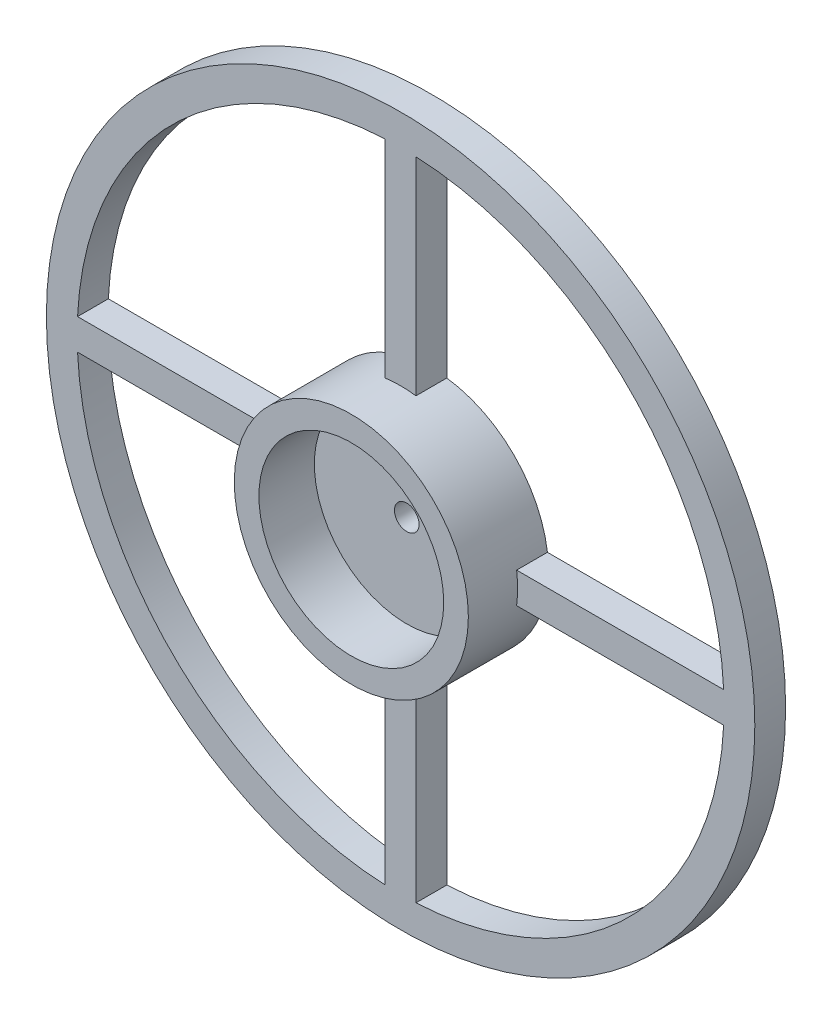
ISO-10303-21;
HEADER;
FILE_DESCRIPTION(('STEP AP214'),'2;1');
FILE_NAME('part.step','',(''),(''),'','','');
FILE_SCHEMA(('AUTOMOTIVE_DESIGN { 1 0 10303 214 1 1 1 1 }'));
ENDSEC;
DATA;
#1=APPLICATION_CONTEXT('core data for automotive mechanical design processes');
#2=APPLICATION_PROTOCOL_DEFINITION('international standard','automotive_design',2000,#1);
#3=PRODUCT_CONTEXT('',#1,'mechanical');
#4=PRODUCT('Part','Part','',(#3));
#5=PRODUCT_RELATED_PRODUCT_CATEGORY('part','',(#4));
#6=PRODUCT_DEFINITION_FORMATION('','',#4);
#7=PRODUCT_DEFINITION_CONTEXT('part definition',#1,'design');
#8=PRODUCT_DEFINITION('design','',#6,#7);
#9=PRODUCT_DEFINITION_SHAPE('','',#8);
#10=(LENGTH_UNIT() NAMED_UNIT(*) SI_UNIT(.MILLI.,.METRE.));
#11=(NAMED_UNIT(*) PLANE_ANGLE_UNIT() SI_UNIT($,.RADIAN.));
#12=(NAMED_UNIT(*) SI_UNIT($,.STERADIAN.) SOLID_ANGLE_UNIT());
#13=UNCERTAINTY_MEASURE_WITH_UNIT(LENGTH_MEASURE(1.E-05),#10,'distance_accuracy_value','');
#14=(GEOMETRIC_REPRESENTATION_CONTEXT(3) GLOBAL_UNCERTAINTY_ASSIGNED_CONTEXT((#13)) GLOBAL_UNIT_ASSIGNED_CONTEXT((#10,
#11,#12)) REPRESENTATION_CONTEXT('',''));
#15=CARTESIAN_POINT('',(0.,0.,0.));
#16=DIRECTION('',(0.,0.,1.));
#17=DIRECTION('',(1.,0.,0.));
#18=AXIS2_PLACEMENT_3D('',#15,#16,#17);
#19=CARTESIAN_POINT('',(0.,0.,5.));
#20=DIRECTION('',(0.,0.,-1.));
#21=DIRECTION('',(-1.,0.,0.));
#22=AXIS2_PLACEMENT_3D('',#19,#20,#21);
#23=CYLINDRICAL_SURFACE('',#22,2.);
#24=CARTESIAN_POINT('',(0.,0.,0.));
#25=DIRECTION('',(0.,0.,1.));
#26=DIRECTION('',(1.,0.,0.));
#27=AXIS2_PLACEMENT_3D('',#24,#25,#26);
#28=CIRCLE('',#27,2.);
#29=CARTESIAN_POINT('',(2.,0.,0.));
#30=VERTEX_POINT('',#29);
#31=EDGE_CURVE('E242',#30,#30,#28,.T.);
#32=ORIENTED_EDGE('',*,*,#31,.F.);
#33=EDGE_LOOP('',(#32));
#34=FACE_BOUND('',#33,.T.);
#35=CARTESIAN_POINT('',(0.,0.,4.));
#36=DIRECTION('',(0.,0.,1.));
#37=DIRECTION('',(1.,0.,0.));
#38=AXIS2_PLACEMENT_3D('',#35,#36,#37);
#39=CIRCLE('',#38,2.);
#40=CARTESIAN_POINT('',(2.,0.,4.));
#41=VERTEX_POINT('',#40);
#42=EDGE_CURVE('E42',#41,#41,#39,.T.);
#43=ORIENTED_EDGE('',*,*,#42,.T.);
#44=EDGE_LOOP('',(#43));
#45=FACE_BOUND('',#44,.T.);
#46=ADVANCED_FACE('F38',(#34,#45),#23,.F.);
#47=CARTESIAN_POINT('',(0.,-2.5,5.));
#48=DIRECTION('',(0.,1.,0.));
#49=DIRECTION('',(-1.,0.,0.));
#50=AXIS2_PLACEMENT_3D('',#47,#48,#49);
#51=PLANE('',#50);
#52=DIRECTION('',(1.,0.,0.));
#53=VECTOR('',#52,1.);
#54=CARTESIAN_POINT('',(0.,-2.5,0.));
#55=LINE('',#54,#53);
#56=CARTESIAN_POINT('',(-52.4404424085076,-2.50000000000001,0.));
#57=VERTEX_POINT('',#56);
#58=CARTESIAN_POINT('',(-18.8348082018374,-2.5,0.));
#59=VERTEX_POINT('',#58);
#60=EDGE_CURVE('E231',#57,#59,#55,.T.);
#61=ORIENTED_EDGE('',*,*,#60,.T.);
#62=DIRECTION('',(0.,0.,-1.));
#63=VECTOR('',#62,1.);
#64=CARTESIAN_POINT('',(-18.8348082018374,-2.5,5.));
#65=LINE('',#64,#63);
#66=CARTESIAN_POINT('',(-18.8348082018374,-2.5,5.));
#67=VERTEX_POINT('',#66);
#68=EDGE_CURVE('E180',#67,#59,#65,.T.);
#69=ORIENTED_EDGE('',*,*,#68,.F.);
#70=DIRECTION('',(1.,0.,0.));
#71=VECTOR('',#70,1.);
#72=CARTESIAN_POINT('',(0.,-2.5,5.));
#73=LINE('',#72,#71);
#74=CARTESIAN_POINT('',(-52.4404424085076,-2.50000000000001,5.));
#75=VERTEX_POINT('',#74);
#76=EDGE_CURVE('E184',#75,#67,#73,.T.);
#77=ORIENTED_EDGE('',*,*,#76,.F.);
#78=DIRECTION('',(0.,0.,-1.));
#79=VECTOR('',#78,1.);
#80=CARTESIAN_POINT('',(-52.4404424085076,-2.50000000000001,5.));
#81=LINE('',#80,#79);
#82=EDGE_CURVE('E58',#75,#57,#81,.T.);
#83=ORIENTED_EDGE('',*,*,#82,.T.);
#84=EDGE_LOOP('',(#61,#69,#77,#83));
#85=FACE_BOUND('',#84,.T.);
#86=ADVANCED_FACE('F350',(#85),#51,.F.);
#87=CARTESIAN_POINT('',(0.,0.,5.));
#88=DIRECTION('',(0.,0.,-1.));
#89=DIRECTION('',(-1.,0.,0.));
#90=AXIS2_PLACEMENT_3D('',#87,#88,#89);
#91=CYLINDRICAL_SURFACE('',#90,19.);
#92=CARTESIAN_POINT('',(0.,0.,0.));
#93=DIRECTION('',(0.,0.,1.));
#94=DIRECTION('',(1.,0.,0.));
#95=AXIS2_PLACEMENT_3D('',#92,#93,#94);
#96=CIRCLE('',#95,19.);
#97=CARTESIAN_POINT('',(-2.5,-18.8348082018374,0.));
#98=VERTEX_POINT('',#97);
#99=EDGE_CURVE('E177',#59,#98,#96,.T.);
#100=ORIENTED_EDGE('',*,*,#99,.T.);
#101=DIRECTION('',(0.,0.,-1.));
#102=VECTOR('',#101,1.);
#103=CARTESIAN_POINT('',(-2.5,-18.8348082018374,5.));
#104=LINE('',#103,#102);
#105=CARTESIAN_POINT('',(-2.5,-18.8348082018374,5.));
#106=VERTEX_POINT('',#105);
#107=EDGE_CURVE('E173',#106,#98,#104,.T.);
#108=ORIENTED_EDGE('',*,*,#107,.F.);
#109=CARTESIAN_POINT('',(0.,0.,5.));
#110=DIRECTION('',(0.,0.,1.));
#111=DIRECTION('',(1.,0.,0.));
#112=AXIS2_PLACEMENT_3D('',#109,#110,#111);
#113=CIRCLE('',#112,19.);
#114=CARTESIAN_POINT('',(2.49999999999999,-18.8348082018374,5.));
#115=VERTEX_POINT('',#114);
#116=EDGE_CURVE('E159',#106,#115,#113,.T.);
#117=ORIENTED_EDGE('',*,*,#116,.T.);
#118=DIRECTION('',(0.,0.,-1.));
#119=VECTOR('',#118,1.);
#120=CARTESIAN_POINT('',(2.49999999999999,-18.8348082018374,5.));
#121=LINE('',#120,#119);
#122=CARTESIAN_POINT('',(2.49999999999999,-18.8348082018374,0.));
#123=VERTEX_POINT('',#122);
#124=EDGE_CURVE('E246',#115,#123,#121,.T.);
#125=ORIENTED_EDGE('',*,*,#124,.T.);
#126=CARTESIAN_POINT('',(0.,0.,0.));
#127=DIRECTION('',(0.,0.,1.));
#128=DIRECTION('',(1.,0.,0.));
#129=AXIS2_PLACEMENT_3D('',#126,#127,#128);
#130=CIRCLE('',#129,19.);
#131=CARTESIAN_POINT('',(18.8348082018374,-2.5,0.));
#132=VERTEX_POINT('',#131);
#133=EDGE_CURVE('E222',#123,#132,#130,.T.);
#134=ORIENTED_EDGE('',*,*,#133,.T.);
#135=DIRECTION('',(0.,0.,-1.));
#136=VECTOR('',#135,1.);
#137=CARTESIAN_POINT('',(18.8348082018374,-2.5,5.));
#138=LINE('',#137,#136);
#139=CARTESIAN_POINT('',(18.8348082018374,-2.5,5.));
#140=VERTEX_POINT('',#139);
#141=EDGE_CURVE('E254',#140,#132,#138,.T.);
#142=ORIENTED_EDGE('',*,*,#141,.F.);
#143=CARTESIAN_POINT('',(18.8348082018374,2.5,5.));
#144=VERTEX_POINT('',#143);
#145=EDGE_CURVE('E50',#140,#144,#113,.T.);
#146=ORIENTED_EDGE('',*,*,#145,.T.);
#147=DIRECTION('',(0.,0.,-1.));
#148=VECTOR('',#147,1.);
#149=CARTESIAN_POINT('',(18.8348082018374,2.5,5.));
#150=LINE('',#149,#148);
#151=CARTESIAN_POINT('',(18.8348082018374,2.5,0.));
#152=VERTEX_POINT('',#151);
#153=EDGE_CURVE('E252',#144,#152,#150,.T.);
#154=ORIENTED_EDGE('',*,*,#153,.T.);
#155=CARTESIAN_POINT('',(0.,0.,0.));
#156=DIRECTION('',(0.,0.,1.));
#157=DIRECTION('',(1.,0.,0.));
#158=AXIS2_PLACEMENT_3D('',#155,#156,#157);
#159=CIRCLE('',#158,19.);
#160=CARTESIAN_POINT('',(2.5,18.8348082018374,0.));
#161=VERTEX_POINT('',#160);
#162=EDGE_CURVE('E210',#152,#161,#159,.T.);
#163=ORIENTED_EDGE('',*,*,#162,.T.);
#164=DIRECTION('',(0.,0.,-1.));
#165=VECTOR('',#164,1.);
#166=CARTESIAN_POINT('',(2.5,18.8348082018374,5.));
#167=LINE('',#166,#165);
#168=CARTESIAN_POINT('',(2.5,18.8348082018374,5.));
#169=VERTEX_POINT('',#168);
#170=EDGE_CURVE('E262',#169,#161,#167,.T.);
#171=ORIENTED_EDGE('',*,*,#170,.F.);
#172=CARTESIAN_POINT('',(-2.5,18.8348082018374,5.));
#173=VERTEX_POINT('',#172);
#174=EDGE_CURVE('E11',#169,#173,#113,.T.);
#175=ORIENTED_EDGE('',*,*,#174,.T.);
#176=DIRECTION('',(0.,0.,-1.));
#177=VECTOR('',#176,1.);
#178=CARTESIAN_POINT('',(-2.5,18.8348082018374,5.));
#179=LINE('',#178,#177);
#180=CARTESIAN_POINT('',(-2.5,18.8348082018374,0.));
#181=VERTEX_POINT('',#180);
#182=EDGE_CURVE('E260',#173,#181,#179,.T.);
#183=ORIENTED_EDGE('',*,*,#182,.T.);
#184=CARTESIAN_POINT('',(0.,0.,0.));
#185=DIRECTION('',(0.,0.,1.));
#186=DIRECTION('',(1.,0.,0.));
#187=AXIS2_PLACEMENT_3D('',#184,#185,#186);
#188=CIRCLE('',#187,19.);
#189=CARTESIAN_POINT('',(-18.8348082018374,2.5,0.));
#190=VERTEX_POINT('',#189);
#191=EDGE_CURVE('E198',#181,#190,#188,.T.);
#192=ORIENTED_EDGE('',*,*,#191,.T.);
#193=DIRECTION('',(0.,0.,-1.));
#194=VECTOR('',#193,1.);
#195=CARTESIAN_POINT('',(-18.8348082018374,2.5,5.));
#196=LINE('',#195,#194);
#197=CARTESIAN_POINT('',(-18.8348082018374,2.5,5.));
#198=VERTEX_POINT('',#197);
#199=EDGE_CURVE('E269',#198,#190,#196,.T.);
#200=ORIENTED_EDGE('',*,*,#199,.F.);
#201=EDGE_CURVE('E48',#198,#67,#113,.T.);
#202=ORIENTED_EDGE('',*,*,#201,.T.);
#203=ORIENTED_EDGE('',*,*,#68,.T.);
#204=EDGE_LOOP('',(#100,#108,#117,#125,#134,#142,#146,#154,#163,#171,#175,#183,#192,#200,#202,#203));
#205=FACE_BOUND('',#204,.T.);
#206=CARTESIAN_POINT('',(0.,0.,13.));
#207=DIRECTION('',(0.,0.,1.));
#208=DIRECTION('',(1.,0.,0.));
#209=AXIS2_PLACEMENT_3D('',#206,#207,#208);
#210=CIRCLE('',#209,19.);
#211=CARTESIAN_POINT('',(19.,0.,13.));
#212=VERTEX_POINT('',#211);
#213=EDGE_CURVE('E293',#212,#212,#210,.T.);
#214=ORIENTED_EDGE('',*,*,#213,.F.);
#215=EDGE_LOOP('',(#214));
#216=FACE_BOUND('',#215,.T.);
#217=ADVANCED_FACE('F174',(#205,#216),#91,.T.);
#218=CARTESIAN_POINT('',(-2.50000000000001,0.,5.));
#219=DIRECTION('',(-1.,0.,0.));
#220=DIRECTION('',(0.,-1.,0.));
#221=AXIS2_PLACEMENT_3D('',#218,#219,#220);
#222=PLANE('',#221);
#223=DIRECTION('',(0.,1.,0.));
#224=VECTOR('',#223,1.);
#225=CARTESIAN_POINT('',(-2.50000000000001,0.,0.));
#226=LINE('',#225,#224);
#227=CARTESIAN_POINT('',(-2.5,-52.4404424085076,0.));
#228=VERTEX_POINT('',#227);
#229=EDGE_CURVE('E234',#228,#98,#226,.T.);
#230=ORIENTED_EDGE('',*,*,#229,.F.);
#231=DIRECTION('',(0.,0.,-1.));
#232=VECTOR('',#231,1.);
#233=CARTESIAN_POINT('',(-2.5,-52.4404424085076,5.));
#234=LINE('',#233,#232);
#235=CARTESIAN_POINT('',(-2.5,-52.4404424085076,5.));
#236=VERTEX_POINT('',#235);
#237=EDGE_CURVE('E109',#236,#228,#234,.T.);
#238=ORIENTED_EDGE('',*,*,#237,.F.);
#239=DIRECTION('',(0.,1.,0.));
#240=VECTOR('',#239,1.);
#241=CARTESIAN_POINT('',(-2.50000000000001,0.,5.));
#242=LINE('',#241,#240);
#243=EDGE_CURVE('E165',#236,#106,#242,.T.);
#244=ORIENTED_EDGE('',*,*,#243,.T.);
#245=ORIENTED_EDGE('',*,*,#107,.T.);
#246=EDGE_LOOP('',(#230,#238,#244,#245));
#247=FACE_BOUND('',#246,.T.);
#248=ADVANCED_FACE('F182',(#247),#222,.T.);
#249=CARTESIAN_POINT('',(2.5,0.,5.));
#250=DIRECTION('',(-1.,0.,0.));
#251=DIRECTION('',(0.,-1.,0.));
#252=AXIS2_PLACEMENT_3D('',#249,#250,#251);
#253=PLANE('',#252);
#254=DIRECTION('',(0.,1.,0.));
#255=VECTOR('',#254,1.);
#256=CARTESIAN_POINT('',(2.5,0.,0.));
#257=LINE('',#256,#255);
#258=CARTESIAN_POINT('',(2.49999999999999,-52.4404424085076,0.));
#259=VERTEX_POINT('',#258);
#260=EDGE_CURVE('E219',#259,#123,#257,.T.);
#261=ORIENTED_EDGE('',*,*,#260,.T.);
#262=ORIENTED_EDGE('',*,*,#124,.F.);
#263=DIRECTION('',(0.,1.,0.));
#264=VECTOR('',#263,1.);
#265=CARTESIAN_POINT('',(2.5,0.,5.));
#266=LINE('',#265,#264);
#267=CARTESIAN_POINT('',(2.49999999999999,-52.4404424085076,5.));
#268=VERTEX_POINT('',#267);
#269=EDGE_CURVE('E168',#268,#115,#266,.T.);
#270=ORIENTED_EDGE('',*,*,#269,.F.);
#271=DIRECTION('',(0.,0.,-1.));
#272=VECTOR('',#271,1.);
#273=CARTESIAN_POINT('',(2.49999999999999,-52.4404424085076,5.));
#274=LINE('',#273,#272);
#275=EDGE_CURVE('E249',#268,#259,#274,.T.);
#276=ORIENTED_EDGE('',*,*,#275,.T.);
#277=EDGE_LOOP('',(#261,#262,#270,#276));
#278=FACE_BOUND('',#277,.T.);
#279=ADVANCED_FACE('F327',(#278),#253,.F.);
#280=CARTESIAN_POINT('',(0.,-2.50000000000002,5.));
#281=DIRECTION('',(0.,-1.,0.));
#282=DIRECTION('',(1.,0.,0.));
#283=AXIS2_PLACEMENT_3D('',#280,#281,#282);
#284=PLANE('',#283);
#285=DIRECTION('',(-1.,0.,0.));
#286=VECTOR('',#285,1.);
#287=CARTESIAN_POINT('',(0.,-2.50000000000002,0.));
#288=LINE('',#287,#286);
#289=CARTESIAN_POINT('',(52.4404424085076,-2.49999999999997,0.));
#290=VERTEX_POINT('',#289);
#291=EDGE_CURVE('E225',#290,#132,#288,.T.);
#292=ORIENTED_EDGE('',*,*,#291,.F.);
#293=DIRECTION('',(0.,0.,-1.));
#294=VECTOR('',#293,1.);
#295=CARTESIAN_POINT('',(52.4404424085076,-2.49999999999997,5.));
#296=LINE('',#295,#294);
#297=CARTESIAN_POINT('',(52.4404424085076,-2.49999999999997,5.));
#298=VERTEX_POINT('',#297);
#299=EDGE_CURVE('E251',#298,#290,#296,.T.);
#300=ORIENTED_EDGE('',*,*,#299,.F.);
#301=DIRECTION('',(-1.,0.,0.));
#302=VECTOR('',#301,1.);
#303=CARTESIAN_POINT('',(0.,-2.50000000000002,5.));
#304=LINE('',#303,#302);
#305=EDGE_CURVE('E311',#298,#140,#304,.T.);
#306=ORIENTED_EDGE('',*,*,#305,.T.);
#307=ORIENTED_EDGE('',*,*,#141,.T.);
#308=EDGE_LOOP('',(#292,#300,#306,#307));
#309=FACE_BOUND('',#308,.T.);
#310=ADVANCED_FACE('F322',(#309),#284,.T.);
#311=CARTESIAN_POINT('',(0.,2.50000000000001,5.));
#312=DIRECTION('',(0.,-1.,0.));
#313=DIRECTION('',(1.,0.,0.));
#314=AXIS2_PLACEMENT_3D('',#311,#312,#313);
#315=PLANE('',#314);
#316=DIRECTION('',(-1.,0.,0.));
#317=VECTOR('',#316,1.);
#318=CARTESIAN_POINT('',(0.,2.50000000000001,0.));
#319=LINE('',#318,#317);
#320=CARTESIAN_POINT('',(52.4404424085076,2.5,0.));
#321=VERTEX_POINT('',#320);
#322=EDGE_CURVE('E207',#321,#152,#319,.T.);
#323=ORIENTED_EDGE('',*,*,#322,.T.);
#324=ORIENTED_EDGE('',*,*,#153,.F.);
#325=DIRECTION('',(-1.,0.,0.));
#326=VECTOR('',#325,1.);
#327=CARTESIAN_POINT('',(0.,2.50000000000001,5.));
#328=LINE('',#327,#326);
#329=CARTESIAN_POINT('',(52.4404424085076,2.5,5.));
#330=VERTEX_POINT('',#329);
#331=EDGE_CURVE('E301',#330,#144,#328,.T.);
#332=ORIENTED_EDGE('',*,*,#331,.F.);
#333=DIRECTION('',(0.,0.,-1.));
#334=VECTOR('',#333,1.);
#335=CARTESIAN_POINT('',(52.4404424085076,2.5,5.));
#336=LINE('',#335,#334);
#337=EDGE_CURVE('E257',#330,#321,#336,.T.);
#338=ORIENTED_EDGE('',*,*,#337,.T.);
#339=EDGE_LOOP('',(#323,#324,#332,#338));
#340=FACE_BOUND('',#339,.T.);
#341=ADVANCED_FACE('F331',(#340),#315,.F.);
#342=CARTESIAN_POINT('',(2.49999999999999,0.,5.));
#343=DIRECTION('',(1.,0.,0.));
#344=DIRECTION('',(0.,1.,0.));
#345=AXIS2_PLACEMENT_3D('',#342,#343,#344);
#346=PLANE('',#345);
#347=DIRECTION('',(0.,-1.,0.));
#348=VECTOR('',#347,1.);
#349=CARTESIAN_POINT('',(2.49999999999999,0.,0.));
#350=LINE('',#349,#348);
#351=CARTESIAN_POINT('',(2.5,52.4404424085076,0.));
#352=VERTEX_POINT('',#351);
#353=EDGE_CURVE('E213',#352,#161,#350,.T.);
#354=ORIENTED_EDGE('',*,*,#353,.F.);
#355=DIRECTION('',(0.,0.,-1.));
#356=VECTOR('',#355,1.);
#357=CARTESIAN_POINT('',(2.5,52.4404424085076,5.));
#358=LINE('',#357,#356);
#359=CARTESIAN_POINT('',(2.5,52.4404424085076,5.));
#360=VERTEX_POINT('',#359);
#361=EDGE_CURVE('E259',#360,#352,#358,.T.);
#362=ORIENTED_EDGE('',*,*,#361,.F.);
#363=DIRECTION('',(0.,-1.,0.));
#364=VECTOR('',#363,1.);
#365=CARTESIAN_POINT('',(2.49999999999999,0.,5.));
#366=LINE('',#365,#364);
#367=EDGE_CURVE('E304',#360,#169,#366,.T.);
#368=ORIENTED_EDGE('',*,*,#367,.T.);
#369=ORIENTED_EDGE('',*,*,#170,.T.);
#370=EDGE_LOOP('',(#354,#362,#368,#369));
#371=FACE_BOUND('',#370,.T.);
#372=ADVANCED_FACE('F340',(#371),#346,.T.);
#373=CARTESIAN_POINT('',(-2.50000000000001,0.,5.));
#374=DIRECTION('',(1.,0.,0.));
#375=DIRECTION('',(0.,1.,0.));
#376=AXIS2_PLACEMENT_3D('',#373,#374,#375);
#377=PLANE('',#376);
#378=DIRECTION('',(0.,-1.,0.));
#379=VECTOR('',#378,1.);
#380=CARTESIAN_POINT('',(-2.50000000000001,0.,0.));
#381=LINE('',#380,#379);
#382=CARTESIAN_POINT('',(-2.5,52.4404424085076,0.));
#383=VERTEX_POINT('',#382);
#384=EDGE_CURVE('E195',#383,#181,#381,.T.);
#385=ORIENTED_EDGE('',*,*,#384,.T.);
#386=ORIENTED_EDGE('',*,*,#182,.F.);
#387=DIRECTION('',(0.,-1.,0.));
#388=VECTOR('',#387,1.);
#389=CARTESIAN_POINT('',(-2.50000000000001,0.,5.));
#390=LINE('',#389,#388);
#391=CARTESIAN_POINT('',(-2.5,52.4404424085076,5.));
#392=VERTEX_POINT('',#391);
#393=EDGE_CURVE('E122',#392,#173,#390,.T.);
#394=ORIENTED_EDGE('',*,*,#393,.F.);
#395=DIRECTION('',(0.,0.,-1.));
#396=VECTOR('',#395,1.);
#397=CARTESIAN_POINT('',(-2.5,52.4404424085076,5.));
#398=LINE('',#397,#396);
#399=EDGE_CURVE('E194',#392,#383,#398,.T.);
#400=ORIENTED_EDGE('',*,*,#399,.T.);
#401=EDGE_LOOP('',(#385,#386,#394,#400));
#402=FACE_BOUND('',#401,.T.);
#403=ADVANCED_FACE('F40',(#402),#377,.F.);
#404=CARTESIAN_POINT('',(0.,2.50000000000001,5.));
#405=DIRECTION('',(0.,1.,0.));
#406=DIRECTION('',(-1.,0.,0.));
#407=AXIS2_PLACEMENT_3D('',#404,#405,#406);
#408=PLANE('',#407);
#409=DIRECTION('',(1.,0.,0.));
#410=VECTOR('',#409,1.);
#411=CARTESIAN_POINT('',(0.,2.50000000000001,0.));
#412=LINE('',#411,#410);
#413=CARTESIAN_POINT('',(-52.4404424085076,2.5,0.));
#414=VERTEX_POINT('',#413);
#415=EDGE_CURVE('E201',#414,#190,#412,.T.);
#416=ORIENTED_EDGE('',*,*,#415,.F.);
#417=DIRECTION('',(0.,0.,-1.));
#418=VECTOR('',#417,1.);
#419=CARTESIAN_POINT('',(-52.4404424085076,2.5,5.));
#420=LINE('',#419,#418);
#421=CARTESIAN_POINT('',(-52.4404424085076,2.5,5.));
#422=VERTEX_POINT('',#421);
#423=EDGE_CURVE('E267',#422,#414,#420,.T.);
#424=ORIENTED_EDGE('',*,*,#423,.F.);
#425=DIRECTION('',(1.,0.,0.));
#426=VECTOR('',#425,1.);
#427=CARTESIAN_POINT('',(0.,2.50000000000001,5.));
#428=LINE('',#427,#426);
#429=EDGE_CURVE('E288',#422,#198,#428,.T.);
#430=ORIENTED_EDGE('',*,*,#429,.T.);
#431=ORIENTED_EDGE('',*,*,#199,.T.);
#432=EDGE_LOOP('',(#416,#424,#430,#431));
#433=FACE_BOUND('',#432,.T.);
#434=ADVANCED_FACE('F287',(#433),#408,.T.);
#435=CARTESIAN_POINT('',(0.,0.,5.));
#436=DIRECTION('',(0.,0.,-1.));
#437=DIRECTION('',(-1.,0.,0.));
#438=AXIS2_PLACEMENT_3D('',#435,#436,#437);
#439=CYLINDRICAL_SURFACE('',#438,57.5);
#440=CARTESIAN_POINT('',(0.,0.,5.));
#441=DIRECTION('',(0.,0.,1.));
#442=DIRECTION('',(1.,0.,0.));
#443=AXIS2_PLACEMENT_3D('',#440,#441,#442);
#444=CIRCLE('',#443,57.5);
#445=CARTESIAN_POINT('',(57.5,0.,5.));
#446=VERTEX_POINT('',#445);
#447=EDGE_CURVE('E186',#446,#446,#444,.T.);
#448=ORIENTED_EDGE('',*,*,#447,.F.);
#449=EDGE_LOOP('',(#448));
#450=FACE_BOUND('',#449,.T.);
#451=CARTESIAN_POINT('',(0.,0.,0.));
#452=DIRECTION('',(0.,0.,1.));
#453=DIRECTION('',(1.,0.,0.));
#454=AXIS2_PLACEMENT_3D('',#451,#452,#453);
#455=CIRCLE('',#454,57.5);
#456=CARTESIAN_POINT('',(57.5,0.,0.));
#457=VERTEX_POINT('',#456);
#458=EDGE_CURVE('E239',#457,#457,#455,.T.);
#459=ORIENTED_EDGE('',*,*,#458,.T.);
#460=EDGE_LOOP('',(#459));
#461=FACE_BOUND('',#460,.T.);
#462=ADVANCED_FACE('F362',(#450,#461),#439,.T.);
#463=CARTESIAN_POINT('',(0.,0.,5.));
#464=DIRECTION('',(0.,0.,-1.));
#465=DIRECTION('',(-1.,0.,0.));
#466=AXIS2_PLACEMENT_3D('',#463,#464,#465);
#467=CYLINDRICAL_SURFACE('',#466,52.5);
#468=CARTESIAN_POINT('',(0.,0.,0.));
#469=DIRECTION('',(0.,0.,1.));
#470=DIRECTION('',(1.,0.,0.));
#471=AXIS2_PLACEMENT_3D('',#468,#469,#470);
#472=CIRCLE('',#471,52.5);
#473=EDGE_CURVE('E236',#57,#228,#472,.T.);
#474=ORIENTED_EDGE('',*,*,#473,.F.);
#475=ORIENTED_EDGE('',*,*,#82,.F.);
#476=CARTESIAN_POINT('',(0.,0.,5.));
#477=DIRECTION('',(0.,0.,1.));
#478=DIRECTION('',(1.,0.,0.));
#479=AXIS2_PLACEMENT_3D('',#476,#477,#478);
#480=CIRCLE('',#479,52.5);
#481=EDGE_CURVE('E183',#75,#236,#480,.T.);
#482=ORIENTED_EDGE('',*,*,#481,.T.);
#483=ORIENTED_EDGE('',*,*,#237,.T.);
#484=EDGE_LOOP('',(#474,#475,#482,#483));
#485=FACE_BOUND('',#484,.T.);
#486=ADVANCED_FACE('F365',(#485),#467,.F.);
#487=CARTESIAN_POINT('',(0.,0.,5.));
#488=DIRECTION('',(0.,0.,-1.));
#489=DIRECTION('',(-1.,0.,0.));
#490=AXIS2_PLACEMENT_3D('',#487,#488,#489);
#491=CYLINDRICAL_SURFACE('',#490,52.5);
#492=CARTESIAN_POINT('',(0.,0.,0.));
#493=DIRECTION('',(0.,0.,1.));
#494=DIRECTION('',(1.,0.,0.));
#495=AXIS2_PLACEMENT_3D('',#492,#493,#494);
#496=CIRCLE('',#495,52.5);
#497=EDGE_CURVE('E228',#259,#290,#496,.T.);
#498=ORIENTED_EDGE('',*,*,#497,.F.);
#499=ORIENTED_EDGE('',*,*,#275,.F.);
#500=CARTESIAN_POINT('',(0.,0.,5.));
#501=DIRECTION('',(0.,0.,1.));
#502=DIRECTION('',(1.,0.,0.));
#503=AXIS2_PLACEMENT_3D('',#500,#501,#502);
#504=CIRCLE('',#503,52.5);
#505=EDGE_CURVE('E188',#268,#298,#504,.T.);
#506=ORIENTED_EDGE('',*,*,#505,.T.);
#507=ORIENTED_EDGE('',*,*,#299,.T.);
#508=EDGE_LOOP('',(#498,#499,#506,#507));
#509=FACE_BOUND('',#508,.T.);
#510=ADVANCED_FACE('F316',(#509),#491,.F.);
#511=CARTESIAN_POINT('',(0.,0.,5.));
#512=DIRECTION('',(0.,0.,-1.));
#513=DIRECTION('',(-1.,0.,0.));
#514=AXIS2_PLACEMENT_3D('',#511,#512,#513);
#515=CYLINDRICAL_SURFACE('',#514,52.5);
#516=CARTESIAN_POINT('',(0.,0.,0.));
#517=DIRECTION('',(0.,0.,1.));
#518=DIRECTION('',(1.,0.,0.));
#519=AXIS2_PLACEMENT_3D('',#516,#517,#518);
#520=CIRCLE('',#519,52.5);
#521=EDGE_CURVE('E216',#321,#352,#520,.T.);
#522=ORIENTED_EDGE('',*,*,#521,.F.);
#523=ORIENTED_EDGE('',*,*,#337,.F.);
#524=CARTESIAN_POINT('',(0.,0.,5.));
#525=DIRECTION('',(0.,0.,1.));
#526=DIRECTION('',(1.,0.,0.));
#527=AXIS2_PLACEMENT_3D('',#524,#525,#526);
#528=CIRCLE('',#527,52.5);
#529=EDGE_CURVE('E307',#330,#360,#528,.T.);
#530=ORIENTED_EDGE('',*,*,#529,.T.);
#531=ORIENTED_EDGE('',*,*,#361,.T.);
#532=EDGE_LOOP('',(#522,#523,#530,#531));
#533=FACE_BOUND('',#532,.T.);
#534=ADVANCED_FACE('F337',(#533),#515,.F.);
#535=CARTESIAN_POINT('',(0.,0.,5.));
#536=DIRECTION('',(0.,0.,-1.));
#537=DIRECTION('',(-1.,0.,0.));
#538=AXIS2_PLACEMENT_3D('',#535,#536,#537);
#539=CYLINDRICAL_SURFACE('',#538,52.5);
#540=CARTESIAN_POINT('',(0.,0.,0.));
#541=DIRECTION('',(0.,0.,1.));
#542=DIRECTION('',(1.,0.,0.));
#543=AXIS2_PLACEMENT_3D('',#540,#541,#542);
#544=CIRCLE('',#543,52.5);
#545=EDGE_CURVE('E204',#383,#414,#544,.T.);
#546=ORIENTED_EDGE('',*,*,#545,.F.);
#547=ORIENTED_EDGE('',*,*,#399,.F.);
#548=CARTESIAN_POINT('',(0.,0.,5.));
#549=DIRECTION('',(0.,0.,1.));
#550=DIRECTION('',(1.,0.,0.));
#551=AXIS2_PLACEMENT_3D('',#548,#549,#550);
#552=CIRCLE('',#551,52.5);
#553=EDGE_CURVE('E283',#392,#422,#552,.T.);
#554=ORIENTED_EDGE('',*,*,#553,.T.);
#555=ORIENTED_EDGE('',*,*,#423,.T.);
#556=EDGE_LOOP('',(#546,#547,#554,#555));
#557=FACE_BOUND('',#556,.T.);
#558=ADVANCED_FACE('F280',(#557),#539,.F.);
#559=CARTESIAN_POINT('',(0.,0.,5.));
#560=DIRECTION('',(0.,0.,1.));
#561=DIRECTION('',(1.,0.,0.));
#562=AXIS2_PLACEMENT_3D('',#559,#560,#561);
#563=PLANE('',#562);
#564=ORIENTED_EDGE('',*,*,#174,.F.);
#565=ORIENTED_EDGE('',*,*,#367,.F.);
#566=ORIENTED_EDGE('',*,*,#529,.F.);
#567=ORIENTED_EDGE('',*,*,#331,.T.);
#568=ORIENTED_EDGE('',*,*,#145,.F.);
#569=ORIENTED_EDGE('',*,*,#305,.F.);
#570=ORIENTED_EDGE('',*,*,#505,.F.);
#571=ORIENTED_EDGE('',*,*,#269,.T.);
#572=ORIENTED_EDGE('',*,*,#116,.F.);
#573=ORIENTED_EDGE('',*,*,#243,.F.);
#574=ORIENTED_EDGE('',*,*,#481,.F.);
#575=ORIENTED_EDGE('',*,*,#76,.T.);
#576=ORIENTED_EDGE('',*,*,#201,.F.);
#577=ORIENTED_EDGE('',*,*,#429,.F.);
#578=ORIENTED_EDGE('',*,*,#553,.F.);
#579=ORIENTED_EDGE('',*,*,#393,.T.);
#580=EDGE_LOOP('',(#564,#565,#566,#567,#568,#569,#570,#571,#572,#573,#574,#575,#576,#577,#578,#579));
#581=FACE_BOUND('',#580,.T.);
#582=ORIENTED_EDGE('',*,*,#447,.T.);
#583=EDGE_LOOP('',(#582));
#584=FACE_BOUND('',#583,.T.);
#585=ADVANCED_FACE('F161',(#581,#584),#563,.T.);
#586=CARTESIAN_POINT('',(0.,0.,0.));
#587=DIRECTION('',(0.,0.,1.));
#588=DIRECTION('',(1.,0.,0.));
#589=AXIS2_PLACEMENT_3D('',#586,#587,#588);
#590=PLANE('',#589);
#591=ORIENTED_EDGE('',*,*,#384,.F.);
#592=ORIENTED_EDGE('',*,*,#545,.T.);
#593=ORIENTED_EDGE('',*,*,#415,.T.);
#594=ORIENTED_EDGE('',*,*,#191,.F.);
#595=EDGE_LOOP('',(#591,#592,#593,#594));
#596=FACE_BOUND('',#595,.T.);
#597=ORIENTED_EDGE('',*,*,#322,.F.);
#598=ORIENTED_EDGE('',*,*,#521,.T.);
#599=ORIENTED_EDGE('',*,*,#353,.T.);
#600=ORIENTED_EDGE('',*,*,#162,.F.);
#601=EDGE_LOOP('',(#597,#598,#599,#600));
#602=FACE_BOUND('',#601,.T.);
#603=ORIENTED_EDGE('',*,*,#260,.F.);
#604=ORIENTED_EDGE('',*,*,#497,.T.);
#605=ORIENTED_EDGE('',*,*,#291,.T.);
#606=ORIENTED_EDGE('',*,*,#133,.F.);
#607=EDGE_LOOP('',(#603,#604,#605,#606));
#608=FACE_BOUND('',#607,.T.);
#609=ORIENTED_EDGE('',*,*,#60,.F.);
#610=ORIENTED_EDGE('',*,*,#473,.T.);
#611=ORIENTED_EDGE('',*,*,#229,.T.);
#612=ORIENTED_EDGE('',*,*,#99,.F.);
#613=EDGE_LOOP('',(#609,#610,#611,#612));
#614=FACE_BOUND('',#613,.T.);
#615=ORIENTED_EDGE('',*,*,#458,.F.);
#616=EDGE_LOOP('',(#615));
#617=FACE_BOUND('',#616,.T.);
#618=ORIENTED_EDGE('',*,*,#31,.T.);
#619=EDGE_LOOP('',(#618));
#620=FACE_BOUND('',#619,.T.);
#621=ADVANCED_FACE('F277',(#596,#602,#608,#614,#617,#620),#590,.F.);
#622=CARTESIAN_POINT('',(0.,0.,4.));
#623=DIRECTION('',(0.,0.,1.));
#624=DIRECTION('',(1.,0.,0.));
#625=AXIS2_PLACEMENT_3D('',#622,#623,#624);
#626=CYLINDRICAL_SURFACE('',#625,15.);
#627=CARTESIAN_POINT('',(0.,0.,4.));
#628=DIRECTION('',(0.,0.,1.));
#629=DIRECTION('',(1.,0.,0.));
#630=AXIS2_PLACEMENT_3D('',#627,#628,#629);
#631=CIRCLE('',#630,15.);
#632=CARTESIAN_POINT('',(15.,0.,4.));
#633=VERTEX_POINT('',#632);
#634=EDGE_CURVE('E295',#633,#633,#631,.T.);
#635=ORIENTED_EDGE('',*,*,#634,.F.);
#636=EDGE_LOOP('',(#635));
#637=FACE_BOUND('',#636,.T.);
#638=CARTESIAN_POINT('',(0.,0.,13.));
#639=DIRECTION('',(0.,0.,1.));
#640=DIRECTION('',(1.,0.,0.));
#641=AXIS2_PLACEMENT_3D('',#638,#639,#640);
#642=CIRCLE('',#641,15.);
#643=CARTESIAN_POINT('',(15.,0.,13.));
#644=VERTEX_POINT('',#643);
#645=EDGE_CURVE('E572',#644,#644,#642,.T.);
#646=ORIENTED_EDGE('',*,*,#645,.T.);
#647=EDGE_LOOP('',(#646));
#648=FACE_BOUND('',#647,.T.);
#649=ADVANCED_FACE('F427',(#637,#648),#626,.F.);
#650=CARTESIAN_POINT('',(0.,0.,4.));
#651=DIRECTION('',(0.,0.,1.));
#652=DIRECTION('',(1.,0.,0.));
#653=AXIS2_PLACEMENT_3D('',#650,#651,#652);
#654=PLANE('',#653);
#655=ORIENTED_EDGE('',*,*,#42,.F.);
#656=EDGE_LOOP('',(#655));
#657=FACE_BOUND('',#656,.T.);
#658=ORIENTED_EDGE('',*,*,#634,.T.);
#659=EDGE_LOOP('',(#658));
#660=FACE_BOUND('',#659,.T.);
#661=ADVANCED_FACE('F439',(#657,#660),#654,.T.);
#662=CARTESIAN_POINT('',(0.,0.,13.));
#663=DIRECTION('',(0.,0.,1.));
#664=DIRECTION('',(1.,0.,0.));
#665=AXIS2_PLACEMENT_3D('',#662,#663,#664);
#666=PLANE('',#665);
#667=ORIENTED_EDGE('',*,*,#213,.T.);
#668=EDGE_LOOP('',(#667));
#669=FACE_BOUND('',#668,.T.);
#670=ORIENTED_EDGE('',*,*,#645,.F.);
#671=EDGE_LOOP('',(#670));
#672=FACE_BOUND('',#671,.T.);
#673=ADVANCED_FACE('F444',(#669,#672),#666,.T.);
#674=CLOSED_SHELL('',(#46,#86,#217,#248,#279,#310,#341,#372,#403,#434,#462,#486,#510,#534,#558,
#585,#621,#649,#661,#673));
#675=MANIFOLD_SOLID_BREP('B2',#674);
#676=ADVANCED_BREP_SHAPE_REPRESENTATION('',(#18,#675),#14);
#677=SHAPE_DEFINITION_REPRESENTATION(#9,#676);
ENDSEC;
END-ISO-10303-21;
